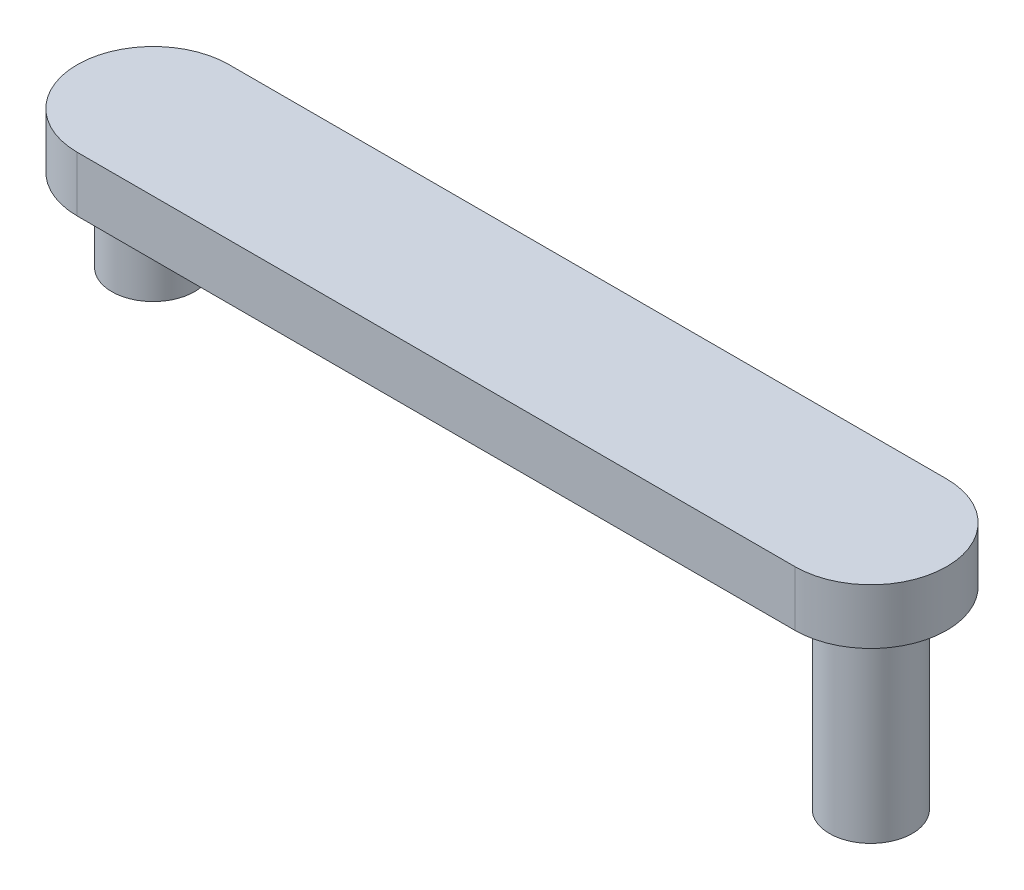
ISO-10303-21;
HEADER;
FILE_DESCRIPTION(('STEP AP214'),'2;1');
FILE_NAME('part.step','',(''),(''),'','','');
FILE_SCHEMA(('AUTOMOTIVE_DESIGN { 1 0 10303 214 1 1 1 1 }'));
ENDSEC;
DATA;
#1=APPLICATION_CONTEXT('core data for automotive mechanical design processes');
#2=APPLICATION_PROTOCOL_DEFINITION('international standard','automotive_design',2000,#1);
#3=PRODUCT_CONTEXT('',#1,'mechanical');
#4=PRODUCT('Part','Part','',(#3));
#5=PRODUCT_RELATED_PRODUCT_CATEGORY('part','',(#4));
#6=PRODUCT_DEFINITION_FORMATION('','',#4);
#7=PRODUCT_DEFINITION_CONTEXT('part definition',#1,'design');
#8=PRODUCT_DEFINITION('design','',#6,#7);
#9=PRODUCT_DEFINITION_SHAPE('','',#8);
#10=(LENGTH_UNIT() NAMED_UNIT(*) SI_UNIT(.MILLI.,.METRE.));
#11=(NAMED_UNIT(*) PLANE_ANGLE_UNIT() SI_UNIT($,.RADIAN.));
#12=(NAMED_UNIT(*) SI_UNIT($,.STERADIAN.) SOLID_ANGLE_UNIT());
#13=UNCERTAINTY_MEASURE_WITH_UNIT(LENGTH_MEASURE(1.E-05),#10,'distance_accuracy_value','');
#14=(GEOMETRIC_REPRESENTATION_CONTEXT(3) GLOBAL_UNCERTAINTY_ASSIGNED_CONTEXT((#13)) GLOBAL_UNIT_ASSIGNED_CONTEXT((#10,
#11,#12)) REPRESENTATION_CONTEXT('',''));
#15=CARTESIAN_POINT('',(0.,0.,0.));
#16=DIRECTION('',(0.,0.,1.));
#17=DIRECTION('',(1.,0.,0.));
#18=AXIS2_PLACEMENT_3D('',#15,#16,#17);
#19=CARTESIAN_POINT('',(0.,3.,0.));
#20=DIRECTION('',(0.,-1.,0.));
#21=DIRECTION('',(0.,0.,-1.));
#22=AXIS2_PLACEMENT_3D('',#19,#20,#21);
#23=CYLINDRICAL_SURFACE('',#22,1.5);
#24=CARTESIAN_POINT('',(0.,3.,0.));
#25=DIRECTION('',(0.,1.,0.));
#26=DIRECTION('',(0.,0.,1.));
#27=AXIS2_PLACEMENT_3D('',#24,#25,#26);
#28=CIRCLE('',#27,1.5);
#29=CARTESIAN_POINT('',(0.,3.,1.5));
#30=VERTEX_POINT('',#29);
#31=EDGE_CURVE('E50',#30,#30,#28,.T.);
#32=ORIENTED_EDGE('',*,*,#31,.F.);
#33=EDGE_LOOP('',(#32));
#34=FACE_BOUND('',#33,.T.);
#35=CARTESIAN_POINT('',(0.,0.,0.));
#36=DIRECTION('',(0.,1.,0.));
#37=DIRECTION('',(0.,0.,1.));
#38=AXIS2_PLACEMENT_3D('',#35,#36,#37);
#39=CIRCLE('',#38,1.5);
#40=CARTESIAN_POINT('',(0.,0.,1.5));
#41=VERTEX_POINT('',#40);
#42=EDGE_CURVE('E130',#41,#41,#39,.T.);
#43=ORIENTED_EDGE('',*,*,#42,.T.);
#44=EDGE_LOOP('',(#43));
#45=FACE_BOUND('',#44,.T.);
#46=ADVANCED_FACE('F41',(#34,#45),#23,.T.);
#47=CARTESIAN_POINT('',(0.,0.,0.));
#48=DIRECTION('',(0.,1.,0.));
#49=DIRECTION('',(0.,0.,1.));
#50=AXIS2_PLACEMENT_3D('',#47,#48,#49);
#51=PLANE('',#50);
#52=ORIENTED_EDGE('',*,*,#42,.F.);
#53=EDGE_LOOP('',(#52));
#54=FACE_BOUND('',#53,.T.);
#55=ADVANCED_FACE('F138',(#54),#51,.F.);
#56=CARTESIAN_POINT('',(0.,5.,0.));
#57=DIRECTION('',(0.,-1.,0.));
#58=DIRECTION('',(0.,0.,-1.));
#59=AXIS2_PLACEMENT_3D('',#56,#57,#58);
#60=CYLINDRICAL_SURFACE('',#59,2.75);
#61=CARTESIAN_POINT('',(0.,3.,0.));
#62=DIRECTION('',(0.,1.,0.));
#63=DIRECTION('',(0.,0.,1.));
#64=AXIS2_PLACEMENT_3D('',#61,#62,#63);
#65=CIRCLE('',#64,2.75);
#66=CARTESIAN_POINT('',(0.,3.,-2.75));
#67=VERTEX_POINT('',#66);
#68=CARTESIAN_POINT('',(0.,3.,2.75));
#69=VERTEX_POINT('',#68);
#70=EDGE_CURVE('E113',#67,#69,#65,.T.);
#71=ORIENTED_EDGE('',*,*,#70,.T.);
#72=DIRECTION('',(0.,-1.,0.));
#73=VECTOR('',#72,1.);
#74=CARTESIAN_POINT('',(0.,5.,2.75));
#75=LINE('',#74,#73);
#76=CARTESIAN_POINT('',(0.,5.,2.75));
#77=VERTEX_POINT('',#76);
#78=EDGE_CURVE('E102',#77,#69,#75,.T.);
#79=ORIENTED_EDGE('',*,*,#78,.F.);
#80=CARTESIAN_POINT('',(0.,5.,0.));
#81=DIRECTION('',(0.,1.,0.));
#82=DIRECTION('',(0.,0.,1.));
#83=AXIS2_PLACEMENT_3D('',#80,#81,#82);
#84=CIRCLE('',#83,2.75);
#85=CARTESIAN_POINT('',(0.,5.,-2.75));
#86=VERTEX_POINT('',#85);
#87=EDGE_CURVE('E94',#86,#77,#84,.T.);
#88=ORIENTED_EDGE('',*,*,#87,.F.);
#89=DIRECTION('',(0.,-1.,0.));
#90=VECTOR('',#89,1.);
#91=CARTESIAN_POINT('',(0.,5.,-2.75));
#92=LINE('',#91,#90);
#93=EDGE_CURVE('E109',#86,#67,#92,.T.);
#94=ORIENTED_EDGE('',*,*,#93,.T.);
#95=EDGE_LOOP('',(#71,#79,#88,#94));
#96=FACE_BOUND('',#95,.T.);
#97=ADVANCED_FACE('F140',(#96),#60,.T.);
#98=CARTESIAN_POINT('',(0.,5.,2.75));
#99=DIRECTION('',(0.,0.,-1.));
#100=DIRECTION('',(-1.,0.,0.));
#101=AXIS2_PLACEMENT_3D('',#98,#99,#100);
#102=PLANE('',#101);
#103=DIRECTION('',(1.,0.,0.));
#104=VECTOR('',#103,1.);
#105=CARTESIAN_POINT('',(0.,3.,2.75));
#106=LINE('',#105,#104);
#107=CARTESIAN_POINT('',(26.,3.,2.75));
#108=VERTEX_POINT('',#107);
#109=EDGE_CURVE('E100',#69,#108,#106,.T.);
#110=ORIENTED_EDGE('',*,*,#109,.T.);
#111=DIRECTION('',(0.,-1.,0.));
#112=VECTOR('',#111,1.);
#113=CARTESIAN_POINT('',(26.,5.,2.75));
#114=LINE('',#113,#112);
#115=CARTESIAN_POINT('',(26.,5.,2.75));
#116=VERTEX_POINT('',#115);
#117=EDGE_CURVE('E98',#116,#108,#114,.T.);
#118=ORIENTED_EDGE('',*,*,#117,.F.);
#119=DIRECTION('',(1.,0.,0.));
#120=VECTOR('',#119,1.);
#121=CARTESIAN_POINT('',(0.,5.,2.75));
#122=LINE('',#121,#120);
#123=EDGE_CURVE('E89',#77,#116,#122,.T.);
#124=ORIENTED_EDGE('',*,*,#123,.F.);
#125=ORIENTED_EDGE('',*,*,#78,.T.);
#126=EDGE_LOOP('',(#110,#118,#124,#125));
#127=FACE_BOUND('',#126,.T.);
#128=ADVANCED_FACE('F99',(#127),#102,.F.);
#129=CARTESIAN_POINT('',(26.,5.,0.));
#130=DIRECTION('',(0.,-1.,0.));
#131=DIRECTION('',(0.,0.,-1.));
#132=AXIS2_PLACEMENT_3D('',#129,#130,#131);
#133=CYLINDRICAL_SURFACE('',#132,2.75);
#134=CARTESIAN_POINT('',(26.,3.,0.));
#135=DIRECTION('',(0.,1.,0.));
#136=DIRECTION('',(0.,0.,1.));
#137=AXIS2_PLACEMENT_3D('',#134,#135,#136);
#138=CIRCLE('',#137,2.75);
#139=CARTESIAN_POINT('',(26.,3.,-2.75));
#140=VERTEX_POINT('',#139);
#141=EDGE_CURVE('E75',#108,#140,#138,.T.);
#142=ORIENTED_EDGE('',*,*,#141,.T.);
#143=DIRECTION('',(0.,-1.,0.));
#144=VECTOR('',#143,1.);
#145=CARTESIAN_POINT('',(26.,5.,-2.75));
#146=LINE('',#145,#144);
#147=CARTESIAN_POINT('',(26.,5.,-2.75));
#148=VERTEX_POINT('',#147);
#149=EDGE_CURVE('E103',#148,#140,#146,.T.);
#150=ORIENTED_EDGE('',*,*,#149,.F.);
#151=CARTESIAN_POINT('',(26.,5.,0.));
#152=DIRECTION('',(0.,1.,0.));
#153=DIRECTION('',(0.,0.,1.));
#154=AXIS2_PLACEMENT_3D('',#151,#152,#153);
#155=CIRCLE('',#154,2.75);
#156=EDGE_CURVE('E92',#116,#148,#155,.T.);
#157=ORIENTED_EDGE('',*,*,#156,.F.);
#158=ORIENTED_EDGE('',*,*,#117,.T.);
#159=EDGE_LOOP('',(#142,#150,#157,#158));
#160=FACE_BOUND('',#159,.T.);
#161=ADVANCED_FACE('F105',(#160),#133,.T.);
#162=CARTESIAN_POINT('',(0.,5.,-2.75));
#163=DIRECTION('',(0.,0.,1.));
#164=DIRECTION('',(1.,0.,0.));
#165=AXIS2_PLACEMENT_3D('',#162,#163,#164);
#166=PLANE('',#165);
#167=DIRECTION('',(-1.,0.,0.));
#168=VECTOR('',#167,1.);
#169=CARTESIAN_POINT('',(0.,3.,-2.75));
#170=LINE('',#169,#168);
#171=EDGE_CURVE('E81',#140,#67,#170,.T.);
#172=ORIENTED_EDGE('',*,*,#171,.T.);
#173=ORIENTED_EDGE('',*,*,#93,.F.);
#174=DIRECTION('',(-1.,0.,0.));
#175=VECTOR('',#174,1.);
#176=CARTESIAN_POINT('',(0.,5.,-2.75));
#177=LINE('',#176,#175);
#178=EDGE_CURVE('E58',#148,#86,#177,.T.);
#179=ORIENTED_EDGE('',*,*,#178,.F.);
#180=ORIENTED_EDGE('',*,*,#149,.T.);
#181=EDGE_LOOP('',(#172,#173,#179,#180));
#182=FACE_BOUND('',#181,.T.);
#183=ADVANCED_FACE('F153',(#182),#166,.F.);
#184=CARTESIAN_POINT('',(0.,5.,0.));
#185=DIRECTION('',(0.,1.,0.));
#186=DIRECTION('',(0.,0.,1.));
#187=AXIS2_PLACEMENT_3D('',#184,#185,#186);
#188=PLANE('',#187);
#189=ORIENTED_EDGE('',*,*,#87,.T.);
#190=ORIENTED_EDGE('',*,*,#123,.T.);
#191=ORIENTED_EDGE('',*,*,#156,.T.);
#192=ORIENTED_EDGE('',*,*,#178,.T.);
#193=EDGE_LOOP('',(#189,#190,#191,#192));
#194=FACE_BOUND('',#193,.T.);
#195=ADVANCED_FACE('F90',(#194),#188,.T.);
#196=CARTESIAN_POINT('',(0.,3.,0.));
#197=DIRECTION('',(0.,1.,0.));
#198=DIRECTION('',(0.,0.,1.));
#199=AXIS2_PLACEMENT_3D('',#196,#197,#198);
#200=PLANE('',#199);
#201=CARTESIAN_POINT('',(26.,3.,0.));
#202=DIRECTION('',(0.,1.,0.));
#203=DIRECTION('',(0.,0.,1.));
#204=AXIS2_PLACEMENT_3D('',#201,#202,#203);
#205=CIRCLE('',#204,1.5);
#206=CARTESIAN_POINT('',(26.,3.,1.5));
#207=VERTEX_POINT('',#206);
#208=EDGE_CURVE('E11',#207,#207,#205,.F.);
#209=ORIENTED_EDGE('',*,*,#208,.F.);
#210=EDGE_LOOP('',(#209));
#211=FACE_BOUND('',#210,.T.);
#212=ORIENTED_EDGE('',*,*,#31,.T.);
#213=EDGE_LOOP('',(#212));
#214=FACE_BOUND('',#213,.T.);
#215=ORIENTED_EDGE('',*,*,#70,.F.);
#216=ORIENTED_EDGE('',*,*,#171,.F.);
#217=ORIENTED_EDGE('',*,*,#141,.F.);
#218=ORIENTED_EDGE('',*,*,#109,.F.);
#219=EDGE_LOOP('',(#215,#216,#217,#218));
#220=FACE_BOUND('',#219,.T.);
#221=ADVANCED_FACE('F156',(#211,#214,#220),#200,.F.);
#222=CARTESIAN_POINT('',(26.,-4.,0.));
#223=DIRECTION('',(0.,1.,0.));
#224=DIRECTION('',(0.,0.,1.));
#225=AXIS2_PLACEMENT_3D('',#222,#223,#224);
#226=CYLINDRICAL_SURFACE('',#225,1.5);
#227=CARTESIAN_POINT('',(26.,-4.,0.));
#228=DIRECTION('',(0.,-1.,0.));
#229=DIRECTION('',(0.,0.,-1.));
#230=AXIS2_PLACEMENT_3D('',#227,#228,#229);
#231=CIRCLE('',#230,1.5);
#232=CARTESIAN_POINT('',(26.,-4.,-1.5));
#233=VERTEX_POINT('',#232);
#234=EDGE_CURVE('E117',#233,#233,#231,.T.);
#235=ORIENTED_EDGE('',*,*,#234,.F.);
#236=EDGE_LOOP('',(#235));
#237=FACE_BOUND('',#236,.T.);
#238=ORIENTED_EDGE('',*,*,#208,.T.);
#239=EDGE_LOOP('',(#238));
#240=FACE_BOUND('',#239,.T.);
#241=ADVANCED_FACE('F159',(#237,#240),#226,.T.);
#242=CARTESIAN_POINT('',(0.,-4.,0.));
#243=DIRECTION('',(0.,-1.,0.));
#244=DIRECTION('',(0.,0.,-1.));
#245=AXIS2_PLACEMENT_3D('',#242,#243,#244);
#246=PLANE('',#245);
#247=ORIENTED_EDGE('',*,*,#234,.T.);
#248=EDGE_LOOP('',(#247));
#249=FACE_BOUND('',#248,.T.);
#250=ADVANCED_FACE('F165',(#249),#246,.T.);
#251=CLOSED_SHELL('',(#46,#55,#97,#128,#161,#183,#195,#221,#241,#250));
#252=MANIFOLD_SOLID_BREP('B2',#251);
#253=ADVANCED_BREP_SHAPE_REPRESENTATION('',(#18,#252),#14);
#254=SHAPE_DEFINITION_REPRESENTATION(#9,#253);
ENDSEC;
END-ISO-10303-21;
